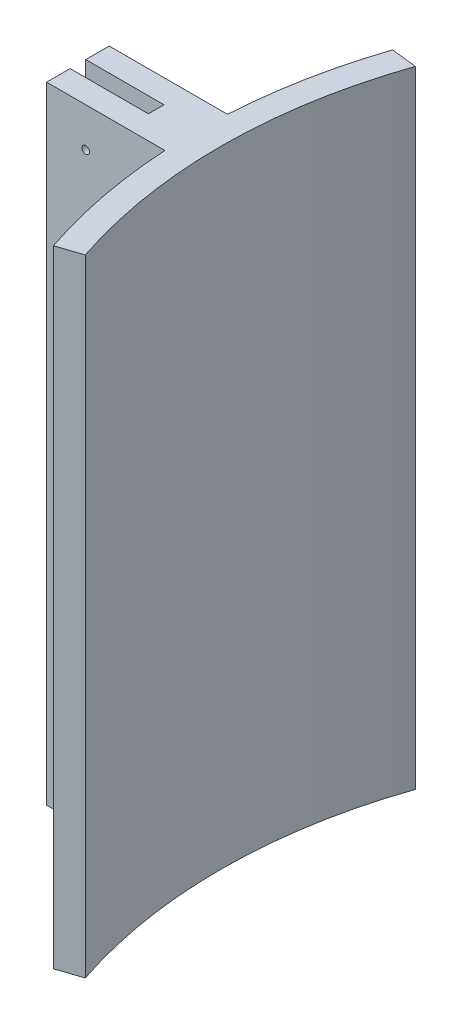
ISO-10303-21;
HEADER;
FILE_DESCRIPTION(('STEP AP214'),'2;1');
FILE_NAME('part.step','',(''),(''),'','','');
FILE_SCHEMA(('AUTOMOTIVE_DESIGN { 1 0 10303 214 1 1 1 1 }'));
ENDSEC;
DATA;
#1=APPLICATION_CONTEXT('core data for automotive mechanical design processes');
#2=APPLICATION_PROTOCOL_DEFINITION('international standard','automotive_design',2000,#1);
#3=PRODUCT_CONTEXT('',#1,'mechanical');
#4=PRODUCT('Part','Part','',(#3));
#5=PRODUCT_RELATED_PRODUCT_CATEGORY('part','',(#4));
#6=PRODUCT_DEFINITION_FORMATION('','',#4);
#7=PRODUCT_DEFINITION_CONTEXT('part definition',#1,'design');
#8=PRODUCT_DEFINITION('design','',#6,#7);
#9=PRODUCT_DEFINITION_SHAPE('','',#8);
#10=(LENGTH_UNIT() NAMED_UNIT(*) SI_UNIT(.MILLI.,.METRE.));
#11=(NAMED_UNIT(*) PLANE_ANGLE_UNIT() SI_UNIT($,.RADIAN.));
#12=(NAMED_UNIT(*) SI_UNIT($,.STERADIAN.) SOLID_ANGLE_UNIT());
#13=UNCERTAINTY_MEASURE_WITH_UNIT(LENGTH_MEASURE(1.E-05),#10,'distance_accuracy_value','');
#14=(GEOMETRIC_REPRESENTATION_CONTEXT(3) GLOBAL_UNCERTAINTY_ASSIGNED_CONTEXT((#13)) GLOBAL_UNIT_ASSIGNED_CONTEXT((#10,
#11,#12)) REPRESENTATION_CONTEXT('',''));
#15=CARTESIAN_POINT('',(0.,0.,0.));
#16=DIRECTION('',(0.,0.,1.));
#17=DIRECTION('',(1.,0.,0.));
#18=AXIS2_PLACEMENT_3D('',#15,#16,#17);
#19=CARTESIAN_POINT('',(0.,80.,0.));
#20=DIRECTION('',(0.,-1.,0.));
#21=DIRECTION('',(0.,0.,-1.));
#22=AXIS2_PLACEMENT_3D('',#19,#20,#21);
#23=CYLINDRICAL_SURFACE('',#22,65.);
#24=CARTESIAN_POINT('',(0.,0.,0.));
#25=DIRECTION('',(0.,-1.,0.));
#26=DIRECTION('',(0.,0.,-1.));
#27=AXIS2_PLACEMENT_3D('',#24,#25,#26);
#28=CIRCLE('',#27,65.);
#29=CARTESIAN_POINT('',(-61.6336537190224,0.,20.6468576118411));
#30=VERTEX_POINT('',#29);
#31=CARTESIAN_POINT('',(-61.4088709399135,0.,-21.3061157859675));
#32=VERTEX_POINT('',#31);
#33=EDGE_CURVE('E161',#30,#32,#28,.T.);
#34=ORIENTED_EDGE('',*,*,#33,.T.);
#35=DIRECTION('',(0.,-1.,0.));
#36=VECTOR('',#35,1.);
#37=CARTESIAN_POINT('',(-61.4088709399135,80.,-21.3061157859675));
#38=LINE('',#37,#36);
#39=CARTESIAN_POINT('',(-61.4088709399135,80.,-21.3061157859675));
#40=VERTEX_POINT('',#39);
#41=EDGE_CURVE('E11',#40,#32,#38,.T.);
#42=ORIENTED_EDGE('',*,*,#41,.F.);
#43=CARTESIAN_POINT('',(0.,80.,0.));
#44=DIRECTION('',(0.,-1.,0.));
#45=DIRECTION('',(0.,0.,-1.));
#46=AXIS2_PLACEMENT_3D('',#43,#44,#45);
#47=CIRCLE('',#46,65.);
#48=CARTESIAN_POINT('',(-61.6336537190224,80.,20.6468576118411));
#49=VERTEX_POINT('',#48);
#50=EDGE_CURVE('E186',#49,#40,#47,.T.);
#51=ORIENTED_EDGE('',*,*,#50,.F.);
#52=DIRECTION('',(0.,-1.,0.));
#53=VECTOR('',#52,1.);
#54=CARTESIAN_POINT('',(-61.6336537190224,80.,20.6468576118411));
#55=LINE('',#54,#53);
#56=EDGE_CURVE('E157',#49,#30,#55,.T.);
#57=ORIENTED_EDGE('',*,*,#56,.T.);
#58=EDGE_LOOP('',(#34,#42,#51,#57));
#59=FACE_BOUND('',#58,.T.);
#60=ADVANCED_FACE('F41',(#59),#23,.F.);
#61=CARTESIAN_POINT('',(-61.4088709399135,80.,-21.3061157859675));
#62=DIRECTION('',(-0.110407498959406,0.,0.9938864040591));
#63=DIRECTION('',(0.9938864040591,0.,0.110407498959406));
#64=AXIS2_PLACEMENT_3D('',#61,#62,#63);
#65=PLANE('',#64);
#66=DIRECTION('',(-0.9938864040591,0.,-0.110407498959406));
#67=VECTOR('',#66,1.);
#68=CARTESIAN_POINT('',(-61.4088709399135,0.,-21.3061157859675));
#69=LINE('',#68,#67);
#70=CARTESIAN_POINT('',(-64.6895195024809,0.,-21.6705520045117));
#71=VERTEX_POINT('',#70);
#72=EDGE_CURVE('E164',#32,#71,#69,.T.);
#73=ORIENTED_EDGE('',*,*,#72,.T.);
#74=DIRECTION('',(0.,-1.,0.));
#75=VECTOR('',#74,1.);
#76=CARTESIAN_POINT('',(-64.6895195024809,80.,-21.6705520045117));
#77=LINE('',#76,#75);
#78=CARTESIAN_POINT('',(-64.6895195024809,80.,-21.6705520045117));
#79=VERTEX_POINT('',#78);
#80=EDGE_CURVE('E50',#79,#71,#77,.T.);
#81=ORIENTED_EDGE('',*,*,#80,.F.);
#82=DIRECTION('',(-0.9938864040591,0.,-0.110407498959406));
#83=VECTOR('',#82,1.);
#84=CARTESIAN_POINT('',(-61.4088709399135,80.,-21.3061157859675));
#85=LINE('',#84,#83);
#86=EDGE_CURVE('E113',#40,#79,#85,.T.);
#87=ORIENTED_EDGE('',*,*,#86,.F.);
#88=ORIENTED_EDGE('',*,*,#41,.T.);
#89=EDGE_LOOP('',(#73,#81,#87,#88));
#90=FACE_BOUND('',#89,.T.);
#91=ADVANCED_FACE('F265',(#90),#65,.F.);
#92=CARTESIAN_POINT('',(0.,80.,0.));
#93=DIRECTION('',(0.,-1.,0.));
#94=DIRECTION('',(0.,0.,-1.));
#95=AXIS2_PLACEMENT_3D('',#92,#93,#94);
#96=CYLINDRICAL_SURFACE('',#95,68.2227730134308);
#97=CARTESIAN_POINT('',(0.,0.,0.));
#98=DIRECTION('',(0.,1.,0.));
#99=DIRECTION('',(0.,0.,-1.));
#100=AXIS2_PLACEMENT_3D('',#97,#98,#99);
#101=CIRCLE('',#100,68.2227730134308);
#102=CARTESIAN_POINT('',(-68.1054091658079,0.,-3.99999999999999));
#103=VERTEX_POINT('',#102);
#104=EDGE_CURVE('E167',#71,#103,#101,.T.);
#105=ORIENTED_EDGE('',*,*,#104,.T.);
#106=DIRECTION('',(0.,-1.,0.));
#107=VECTOR('',#106,1.);
#108=CARTESIAN_POINT('',(-68.1054091658079,80.,-3.99999999999999));
#109=LINE('',#108,#107);
#110=CARTESIAN_POINT('',(-68.1054091658079,80.,-3.99999999999999));
#111=VERTEX_POINT('',#110);
#112=EDGE_CURVE('E205',#111,#103,#109,.T.);
#113=ORIENTED_EDGE('',*,*,#112,.F.);
#114=CARTESIAN_POINT('',(0.,80.,0.));
#115=DIRECTION('',(0.,1.,0.));
#116=DIRECTION('',(0.,0.,-1.));
#117=AXIS2_PLACEMENT_3D('',#114,#115,#116);
#118=CIRCLE('',#117,68.2227730134308);
#119=EDGE_CURVE('E214',#79,#111,#118,.T.);
#120=ORIENTED_EDGE('',*,*,#119,.F.);
#121=ORIENTED_EDGE('',*,*,#80,.T.);
#122=EDGE_LOOP('',(#105,#113,#120,#121));
#123=FACE_BOUND('',#122,.T.);
#124=ADVANCED_FACE('F212',(#123),#96,.T.);
#125=CARTESIAN_POINT('',(-68.2227730134308,80.,-3.99999999999999));
#126=DIRECTION('',(0.,0.,1.));
#127=DIRECTION('',(1.,0.,0.));
#128=AXIS2_PLACEMENT_3D('',#125,#126,#127);
#129=PLANE('',#128);
#130=CARTESIAN_POINT('',(-78.2227730134308,75.,-3.99999999999999));
#131=DIRECTION('',(0.,0.,1.));
#132=DIRECTION('',(1.,0.,0.));
#133=AXIS2_PLACEMENT_3D('',#130,#131,#132);
#134=CIRCLE('',#133,0.474999999999989);
#135=CARTESIAN_POINT('',(-77.7477730134308,75.,-3.99999999999999));
#136=VERTEX_POINT('',#135);
#137=EDGE_CURVE('E498',#136,#136,#134,.T.);
#138=ORIENTED_EDGE('',*,*,#137,.T.);
#139=EDGE_LOOP('',(#138));
#140=FACE_BOUND('',#139,.T.);
#141=CARTESIAN_POINT('',(-78.2227730134308,40.,-3.99999999999999));
#142=DIRECTION('',(0.,0.,1.));
#143=DIRECTION('',(1.,0.,0.));
#144=AXIS2_PLACEMENT_3D('',#141,#142,#143);
#145=CIRCLE('',#144,0.474999999999989);
#146=CARTESIAN_POINT('',(-77.7477730134308,40.,-3.99999999999999));
#147=VERTEX_POINT('',#146);
#148=EDGE_CURVE('E309',#147,#147,#145,.T.);
#149=ORIENTED_EDGE('',*,*,#148,.T.);
#150=EDGE_LOOP('',(#149));
#151=FACE_BOUND('',#150,.T.);
#152=CARTESIAN_POINT('',(-78.2227730134308,5.,-3.99999999999999));
#153=DIRECTION('',(0.,0.,1.));
#154=DIRECTION('',(1.,0.,0.));
#155=AXIS2_PLACEMENT_3D('',#152,#153,#154);
#156=CIRCLE('',#155,0.474999999999989);
#157=CARTESIAN_POINT('',(-77.7477730134308,5.,-3.99999999999999));
#158=VERTEX_POINT('',#157);
#159=EDGE_CURVE('E165',#158,#158,#156,.T.);
#160=ORIENTED_EDGE('',*,*,#159,.T.);
#161=EDGE_LOOP('',(#160));
#162=FACE_BOUND('',#161,.T.);
#163=DIRECTION('',(-1.,0.,0.));
#164=VECTOR('',#163,1.);
#165=CARTESIAN_POINT('',(-68.2227730134308,0.,-3.99999999999999));
#166=LINE('',#165,#164);
#167=CARTESIAN_POINT('',(-83.2227730134308,0.,-3.99999999999999));
#168=VERTEX_POINT('',#167);
#169=EDGE_CURVE('E170',#103,#168,#166,.T.);
#170=ORIENTED_EDGE('',*,*,#169,.T.);
#171=DIRECTION('',(0.,-1.,0.));
#172=VECTOR('',#171,1.);
#173=CARTESIAN_POINT('',(-83.2227730134308,80.,-3.99999999999999));
#174=LINE('',#173,#172);
#175=CARTESIAN_POINT('',(-83.2227730134308,80.,-3.99999999999999));
#176=VERTEX_POINT('',#175);
#177=EDGE_CURVE('E202',#176,#168,#174,.T.);
#178=ORIENTED_EDGE('',*,*,#177,.F.);
#179=DIRECTION('',(-1.,0.,0.));
#180=VECTOR('',#179,1.);
#181=CARTESIAN_POINT('',(-68.2227730134308,80.,-3.99999999999999));
#182=LINE('',#181,#180);
#183=EDGE_CURVE('E231',#111,#176,#182,.T.);
#184=ORIENTED_EDGE('',*,*,#183,.F.);
#185=ORIENTED_EDGE('',*,*,#112,.T.);
#186=EDGE_LOOP('',(#170,#178,#184,#185));
#187=FACE_BOUND('',#186,.T.);
#188=ADVANCED_FACE('F222',(#140,#151,#162,#187),#129,.F.);
#189=CARTESIAN_POINT('',(-83.2227730134308,80.,-3.99999999999999));
#190=DIRECTION('',(1.,0.,0.));
#191=DIRECTION('',(0.,0.,-1.));
#192=AXIS2_PLACEMENT_3D('',#189,#190,#191);
#193=PLANE('',#192);
#194=DIRECTION('',(0.,0.,1.));
#195=VECTOR('',#194,1.);
#196=CARTESIAN_POINT('',(-83.2227730134308,0.,-3.99999999999999));
#197=LINE('',#196,#195);
#198=CARTESIAN_POINT('',(-83.2227730134308,0.,-1.00000000000002));
#199=VERTEX_POINT('',#198);
#200=EDGE_CURVE('E172',#168,#199,#197,.T.);
#201=ORIENTED_EDGE('',*,*,#200,.T.);
#202=DIRECTION('',(0.,-1.,0.));
#203=VECTOR('',#202,1.);
#204=CARTESIAN_POINT('',(-83.2227730134308,80.,-1.00000000000002));
#205=LINE('',#204,#203);
#206=CARTESIAN_POINT('',(-83.2227730134308,80.,-1.00000000000002));
#207=VERTEX_POINT('',#206);
#208=EDGE_CURVE('E199',#207,#199,#205,.T.);
#209=ORIENTED_EDGE('',*,*,#208,.F.);
#210=DIRECTION('',(0.,0.,1.));
#211=VECTOR('',#210,1.);
#212=CARTESIAN_POINT('',(-83.2227730134308,80.,-3.99999999999999));
#213=LINE('',#212,#211);
#214=EDGE_CURVE('E228',#176,#207,#213,.T.);
#215=ORIENTED_EDGE('',*,*,#214,.F.);
#216=ORIENTED_EDGE('',*,*,#177,.T.);
#217=EDGE_LOOP('',(#201,#209,#215,#216));
#218=FACE_BOUND('',#217,.T.);
#219=ADVANCED_FACE('F226',(#218),#193,.F.);
#220=CARTESIAN_POINT('',(-83.2227730134308,80.,-1.00000000000002));
#221=DIRECTION('',(0.,0.,-1.));
#222=DIRECTION('',(-1.,0.,0.));
#223=AXIS2_PLACEMENT_3D('',#220,#221,#222);
#224=PLANE('',#223);
#225=CARTESIAN_POINT('',(-78.2227730134308,75.,-1.00000000000002));
#226=DIRECTION('',(0.,0.,-1.));
#227=DIRECTION('',(-1.,0.,0.));
#228=AXIS2_PLACEMENT_3D('',#225,#226,#227);
#229=CIRCLE('',#228,0.474999999999989);
#230=CARTESIAN_POINT('',(-78.6977730134308,75.,-1.00000000000002));
#231=VERTEX_POINT('',#230);
#232=EDGE_CURVE('E504',#231,#231,#229,.T.);
#233=ORIENTED_EDGE('',*,*,#232,.T.);
#234=EDGE_LOOP('',(#233));
#235=FACE_BOUND('',#234,.T.);
#236=CARTESIAN_POINT('',(-78.2227730134308,40.,-1.00000000000002));
#237=DIRECTION('',(0.,0.,-1.));
#238=DIRECTION('',(-1.,0.,0.));
#239=AXIS2_PLACEMENT_3D('',#236,#237,#238);
#240=CIRCLE('',#239,0.474999999999989);
#241=CARTESIAN_POINT('',(-78.6977730134308,40.,-1.00000000000002));
#242=VERTEX_POINT('',#241);
#243=EDGE_CURVE('E44',#242,#242,#240,.T.);
#244=ORIENTED_EDGE('',*,*,#243,.T.);
#245=EDGE_LOOP('',(#244));
#246=FACE_BOUND('',#245,.T.);
#247=CARTESIAN_POINT('',(-78.2227730134308,5.,-1.00000000000002));
#248=DIRECTION('',(0.,0.,-1.));
#249=DIRECTION('',(-1.,0.,0.));
#250=AXIS2_PLACEMENT_3D('',#247,#248,#249);
#251=CIRCLE('',#250,0.474999999999989);
#252=CARTESIAN_POINT('',(-78.6977730134308,5.,-1.00000000000002));
#253=VERTEX_POINT('',#252);
#254=EDGE_CURVE('E312',#253,#253,#251,.T.);
#255=ORIENTED_EDGE('',*,*,#254,.T.);
#256=EDGE_LOOP('',(#255));
#257=FACE_BOUND('',#256,.T.);
#258=DIRECTION('',(1.,0.,0.));
#259=VECTOR('',#258,1.);
#260=CARTESIAN_POINT('',(-83.2227730134308,0.,-1.00000000000002));
#261=LINE('',#260,#259);
#262=CARTESIAN_POINT('',(-73.2227730134308,0.,-1.00000000000002));
#263=VERTEX_POINT('',#262);
#264=EDGE_CURVE('E174',#199,#263,#261,.T.);
#265=ORIENTED_EDGE('',*,*,#264,.T.);
#266=DIRECTION('',(0.,-1.,0.));
#267=VECTOR('',#266,1.);
#268=CARTESIAN_POINT('',(-73.2227730134308,80.,-1.00000000000002));
#269=LINE('',#268,#267);
#270=CARTESIAN_POINT('',(-73.2227730134308,80.,-1.00000000000002));
#271=VERTEX_POINT('',#270);
#272=EDGE_CURVE('E196',#271,#263,#269,.T.);
#273=ORIENTED_EDGE('',*,*,#272,.F.);
#274=DIRECTION('',(1.,0.,0.));
#275=VECTOR('',#274,1.);
#276=CARTESIAN_POINT('',(-83.2227730134308,80.,-1.00000000000002));
#277=LINE('',#276,#275);
#278=EDGE_CURVE('E230',#207,#271,#277,.T.);
#279=ORIENTED_EDGE('',*,*,#278,.F.);
#280=ORIENTED_EDGE('',*,*,#208,.T.);
#281=EDGE_LOOP('',(#265,#273,#279,#280));
#282=FACE_BOUND('',#281,.T.);
#283=ADVANCED_FACE('F279',(#235,#246,#257,#282),#224,.F.);
#284=CARTESIAN_POINT('',(-73.2227730134308,80.,1.00000000000001));
#285=DIRECTION('',(1.,0.,0.));
#286=DIRECTION('',(0.,0.,-1.));
#287=AXIS2_PLACEMENT_3D('',#284,#285,#286);
#288=PLANE('',#287);
#289=DIRECTION('',(0.,0.,1.));
#290=VECTOR('',#289,1.);
#291=CARTESIAN_POINT('',(-73.2227730134308,0.,1.00000000000001));
#292=LINE('',#291,#290);
#293=CARTESIAN_POINT('',(-73.2227730134308,0.,1.00000000000001));
#294=VERTEX_POINT('',#293);
#295=EDGE_CURVE('E176',#263,#294,#292,.T.);
#296=ORIENTED_EDGE('',*,*,#295,.T.);
#297=DIRECTION('',(0.,-1.,0.));
#298=VECTOR('',#297,1.);
#299=CARTESIAN_POINT('',(-73.2227730134308,80.,1.00000000000001));
#300=LINE('',#299,#298);
#301=CARTESIAN_POINT('',(-73.2227730134308,80.,1.00000000000001));
#302=VERTEX_POINT('',#301);
#303=EDGE_CURVE('E193',#302,#294,#300,.T.);
#304=ORIENTED_EDGE('',*,*,#303,.F.);
#305=DIRECTION('',(0.,0.,1.));
#306=VECTOR('',#305,1.);
#307=CARTESIAN_POINT('',(-73.2227730134308,80.,1.00000000000001));
#308=LINE('',#307,#306);
#309=EDGE_CURVE('E233',#271,#302,#308,.T.);
#310=ORIENTED_EDGE('',*,*,#309,.F.);
#311=ORIENTED_EDGE('',*,*,#272,.T.);
#312=EDGE_LOOP('',(#296,#304,#310,#311));
#313=FACE_BOUND('',#312,.T.);
#314=ADVANCED_FACE('F282',(#313),#288,.F.);
#315=CARTESIAN_POINT('',(-83.2227730134308,80.,1.00000000000001));
#316=DIRECTION('',(0.,0.,1.));
#317=DIRECTION('',(1.,0.,0.));
#318=AXIS2_PLACEMENT_3D('',#315,#316,#317);
#319=PLANE('',#318);
#320=CARTESIAN_POINT('',(-78.2227730134308,75.,1.00000000000001));
#321=DIRECTION('',(0.,0.,1.));
#322=DIRECTION('',(1.,0.,0.));
#323=AXIS2_PLACEMENT_3D('',#320,#321,#322);
#324=CIRCLE('',#323,0.474999999999989);
#325=CARTESIAN_POINT('',(-77.7477730134308,75.,1.00000000000001));
#326=VERTEX_POINT('',#325);
#327=EDGE_CURVE('E501',#326,#326,#324,.T.);
#328=ORIENTED_EDGE('',*,*,#327,.T.);
#329=EDGE_LOOP('',(#328));
#330=FACE_BOUND('',#329,.T.);
#331=CARTESIAN_POINT('',(-78.2227730134308,40.,1.00000000000001));
#332=DIRECTION('',(0.,0.,1.));
#333=DIRECTION('',(1.,0.,0.));
#334=AXIS2_PLACEMENT_3D('',#331,#332,#333);
#335=CIRCLE('',#334,0.474999999999989);
#336=CARTESIAN_POINT('',(-77.7477730134308,40.,1.00000000000001));
#337=VERTEX_POINT('',#336);
#338=EDGE_CURVE('E315',#337,#337,#335,.T.);
#339=ORIENTED_EDGE('',*,*,#338,.T.);
#340=EDGE_LOOP('',(#339));
#341=FACE_BOUND('',#340,.T.);
#342=CARTESIAN_POINT('',(-78.2227730134308,5.,1.00000000000001));
#343=DIRECTION('',(0.,0.,1.));
#344=DIRECTION('',(1.,0.,0.));
#345=AXIS2_PLACEMENT_3D('',#342,#343,#344);
#346=CIRCLE('',#345,0.474999999999989);
#347=CARTESIAN_POINT('',(-77.7477730134308,5.,1.00000000000001));
#348=VERTEX_POINT('',#347);
#349=EDGE_CURVE('E308',#348,#348,#346,.T.);
#350=ORIENTED_EDGE('',*,*,#349,.T.);
#351=EDGE_LOOP('',(#350));
#352=FACE_BOUND('',#351,.T.);
#353=DIRECTION('',(-1.,0.,0.));
#354=VECTOR('',#353,1.);
#355=CARTESIAN_POINT('',(-83.2227730134308,0.,1.00000000000001));
#356=LINE('',#355,#354);
#357=CARTESIAN_POINT('',(-83.2227730134308,0.,1.00000000000001));
#358=VERTEX_POINT('',#357);
#359=EDGE_CURVE('E178',#294,#358,#356,.T.);
#360=ORIENTED_EDGE('',*,*,#359,.T.);
#361=DIRECTION('',(0.,-1.,0.));
#362=VECTOR('',#361,1.);
#363=CARTESIAN_POINT('',(-83.2227730134308,80.,1.00000000000001));
#364=LINE('',#363,#362);
#365=CARTESIAN_POINT('',(-83.2227730134308,80.,1.00000000000001));
#366=VERTEX_POINT('',#365);
#367=EDGE_CURVE('E190',#366,#358,#364,.T.);
#368=ORIENTED_EDGE('',*,*,#367,.F.);
#369=DIRECTION('',(-1.,0.,0.));
#370=VECTOR('',#369,1.);
#371=CARTESIAN_POINT('',(-83.2227730134308,80.,1.00000000000001));
#372=LINE('',#371,#370);
#373=EDGE_CURVE('E239',#302,#366,#372,.T.);
#374=ORIENTED_EDGE('',*,*,#373,.F.);
#375=ORIENTED_EDGE('',*,*,#303,.T.);
#376=EDGE_LOOP('',(#360,#368,#374,#375));
#377=FACE_BOUND('',#376,.T.);
#378=ADVANCED_FACE('F245',(#330,#341,#352,#377),#319,.F.);
#379=CARTESIAN_POINT('',(-83.2227730134308,80.,1.00000000000001));
#380=DIRECTION('',(1.,0.,0.));
#381=DIRECTION('',(0.,0.,-1.));
#382=AXIS2_PLACEMENT_3D('',#379,#380,#381);
#383=PLANE('',#382);
#384=DIRECTION('',(0.,0.,1.));
#385=VECTOR('',#384,1.);
#386=CARTESIAN_POINT('',(-83.2227730134308,0.,1.00000000000001));
#387=LINE('',#386,#385);
#388=CARTESIAN_POINT('',(-83.2227730134308,0.,4.00000000000001));
#389=VERTEX_POINT('',#388);
#390=EDGE_CURVE('E180',#358,#389,#387,.T.);
#391=ORIENTED_EDGE('',*,*,#390,.T.);
#392=DIRECTION('',(0.,-1.,0.));
#393=VECTOR('',#392,1.);
#394=CARTESIAN_POINT('',(-83.2227730134308,80.,4.00000000000001));
#395=LINE('',#394,#393);
#396=CARTESIAN_POINT('',(-83.2227730134308,80.,4.00000000000001));
#397=VERTEX_POINT('',#396);
#398=EDGE_CURVE('E152',#397,#389,#395,.T.);
#399=ORIENTED_EDGE('',*,*,#398,.F.);
#400=DIRECTION('',(0.,0.,1.));
#401=VECTOR('',#400,1.);
#402=CARTESIAN_POINT('',(-83.2227730134308,80.,1.00000000000001));
#403=LINE('',#402,#401);
#404=EDGE_CURVE('E144',#366,#397,#403,.T.);
#405=ORIENTED_EDGE('',*,*,#404,.F.);
#406=ORIENTED_EDGE('',*,*,#367,.T.);
#407=EDGE_LOOP('',(#391,#399,#405,#406));
#408=FACE_BOUND('',#407,.T.);
#409=ADVANCED_FACE('F249',(#408),#383,.F.);
#410=CARTESIAN_POINT('',(-68.2227730134308,80.,4.00000000000001));
#411=DIRECTION('',(0.,0.,-1.));
#412=DIRECTION('',(-1.,0.,0.));
#413=AXIS2_PLACEMENT_3D('',#410,#411,#412);
#414=PLANE('',#413);
#415=CARTESIAN_POINT('',(-78.2227730134308,75.,4.00000000000001));
#416=DIRECTION('',(0.,0.,1.));
#417=DIRECTION('',(1.,0.,0.));
#418=AXIS2_PLACEMENT_3D('',#415,#416,#417);
#419=CIRCLE('',#418,0.474999999999989);
#420=CARTESIAN_POINT('',(-77.7477730134308,75.,4.00000000000001));
#421=VERTEX_POINT('',#420);
#422=EDGE_CURVE('E299',#421,#421,#419,.T.);
#423=ORIENTED_EDGE('',*,*,#422,.F.);
#424=EDGE_LOOP('',(#423));
#425=FACE_BOUND('',#424,.T.);
#426=CARTESIAN_POINT('',(-78.2227730134308,40.,4.00000000000001));
#427=DIRECTION('',(0.,0.,1.));
#428=DIRECTION('',(1.,0.,0.));
#429=AXIS2_PLACEMENT_3D('',#426,#427,#428);
#430=CIRCLE('',#429,0.474999999999989);
#431=CARTESIAN_POINT('',(-77.7477730134308,40.,4.00000000000001));
#432=VERTEX_POINT('',#431);
#433=EDGE_CURVE('E303',#432,#432,#430,.T.);
#434=ORIENTED_EDGE('',*,*,#433,.F.);
#435=EDGE_LOOP('',(#434));
#436=FACE_BOUND('',#435,.T.);
#437=CARTESIAN_POINT('',(-78.2227730134308,5.,4.00000000000001));
#438=DIRECTION('',(0.,0.,1.));
#439=DIRECTION('',(1.,0.,0.));
#440=AXIS2_PLACEMENT_3D('',#437,#438,#439);
#441=CIRCLE('',#440,0.474999999999989);
#442=CARTESIAN_POINT('',(-77.7477730134308,5.,4.00000000000001));
#443=VERTEX_POINT('',#442);
#444=EDGE_CURVE('E306',#443,#443,#441,.T.);
#445=ORIENTED_EDGE('',*,*,#444,.F.);
#446=EDGE_LOOP('',(#445));
#447=FACE_BOUND('',#446,.T.);
#448=DIRECTION('',(1.,0.,0.));
#449=VECTOR('',#448,1.);
#450=CARTESIAN_POINT('',(-68.2227730134308,0.,4.00000000000001));
#451=LINE('',#450,#449);
#452=CARTESIAN_POINT('',(-68.1054091658079,0.,4.00000000000004));
#453=VERTEX_POINT('',#452);
#454=EDGE_CURVE('E151',#389,#453,#451,.T.);
#455=ORIENTED_EDGE('',*,*,#454,.T.);
#456=DIRECTION('',(0.,-1.,0.));
#457=VECTOR('',#456,1.);
#458=CARTESIAN_POINT('',(-68.1054091658079,80.,4.00000000000004));
#459=LINE('',#458,#457);
#460=CARTESIAN_POINT('',(-68.1054091658079,80.,4.00000000000004));
#461=VERTEX_POINT('',#460);
#462=EDGE_CURVE('E149',#461,#453,#459,.T.);
#463=ORIENTED_EDGE('',*,*,#462,.F.);
#464=DIRECTION('',(1.,0.,0.));
#465=VECTOR('',#464,1.);
#466=CARTESIAN_POINT('',(-68.2227730134308,80.,4.00000000000001));
#467=LINE('',#466,#465);
#468=EDGE_CURVE('E138',#397,#461,#467,.T.);
#469=ORIENTED_EDGE('',*,*,#468,.F.);
#470=ORIENTED_EDGE('',*,*,#398,.T.);
#471=EDGE_LOOP('',(#455,#463,#469,#470));
#472=FACE_BOUND('',#471,.T.);
#473=ADVANCED_FACE('F150',(#425,#436,#447,#472),#414,.F.);
#474=CARTESIAN_POINT('',(0.,80.,0.));
#475=DIRECTION('',(0.,-1.,0.));
#476=DIRECTION('',(0.,0.,-1.));
#477=AXIS2_PLACEMENT_3D('',#474,#475,#476);
#478=CYLINDRICAL_SURFACE('',#477,68.2227730134308);
#479=CARTESIAN_POINT('',(0.,0.,0.));
#480=DIRECTION('',(0.,1.,0.));
#481=DIRECTION('',(0.,0.,-1.));
#482=AXIS2_PLACEMENT_3D('',#479,#480,#481);
#483=CIRCLE('',#482,68.2227730134308);
#484=CARTESIAN_POINT('',(-64.6895195024809,0.,21.6705520045118));
#485=VERTEX_POINT('',#484);
#486=EDGE_CURVE('E99',#453,#485,#483,.T.);
#487=ORIENTED_EDGE('',*,*,#486,.T.);
#488=DIRECTION('',(0.,-1.,0.));
#489=VECTOR('',#488,1.);
#490=CARTESIAN_POINT('',(-64.6895195024809,80.,21.6705520045118));
#491=LINE('',#490,#489);
#492=CARTESIAN_POINT('',(-64.6895195024809,80.,21.6705520045118));
#493=VERTEX_POINT('',#492);
#494=EDGE_CURVE('E153',#493,#485,#491,.T.);
#495=ORIENTED_EDGE('',*,*,#494,.F.);
#496=CARTESIAN_POINT('',(0.,80.,0.));
#497=DIRECTION('',(0.,1.,0.));
#498=DIRECTION('',(0.,0.,-1.));
#499=AXIS2_PLACEMENT_3D('',#496,#497,#498);
#500=CIRCLE('',#499,68.2227730134308);
#501=EDGE_CURVE('E142',#461,#493,#500,.T.);
#502=ORIENTED_EDGE('',*,*,#501,.F.);
#503=ORIENTED_EDGE('',*,*,#462,.T.);
#504=EDGE_LOOP('',(#487,#495,#502,#503));
#505=FACE_BOUND('',#504,.T.);
#506=ADVANCED_FACE('F155',(#505),#478,.T.);
#507=CARTESIAN_POINT('',(-61.6336537190224,80.,20.6468576118411));
#508=DIRECTION('',(-0.317643963259093,0.,-0.948210057215729));
#509=DIRECTION('',(-0.948210057215729,0.,0.317643963259093));
#510=AXIS2_PLACEMENT_3D('',#507,#508,#509);
#511=PLANE('',#510);
#512=DIRECTION('',(0.948210057215729,0.,-0.317643963259093));
#513=VECTOR('',#512,1.);
#514=CARTESIAN_POINT('',(-61.6336537190224,0.,20.6468576118411));
#515=LINE('',#514,#513);
#516=EDGE_CURVE('E105',#485,#30,#515,.T.);
#517=ORIENTED_EDGE('',*,*,#516,.T.);
#518=ORIENTED_EDGE('',*,*,#56,.F.);
#519=DIRECTION('',(0.948210057215729,0.,-0.317643963259093));
#520=VECTOR('',#519,1.);
#521=CARTESIAN_POINT('',(-61.6336537190224,80.,20.6468576118411));
#522=LINE('',#521,#520);
#523=EDGE_CURVE('E58',#493,#49,#522,.T.);
#524=ORIENTED_EDGE('',*,*,#523,.F.);
#525=ORIENTED_EDGE('',*,*,#494,.T.);
#526=EDGE_LOOP('',(#517,#518,#524,#525));
#527=FACE_BOUND('',#526,.T.);
#528=ADVANCED_FACE('F254',(#527),#511,.F.);
#529=CARTESIAN_POINT('',(0.,80.,0.));
#530=DIRECTION('',(0.,-1.,0.));
#531=DIRECTION('',(0.,0.,-1.));
#532=AXIS2_PLACEMENT_3D('',#529,#530,#531);
#533=PLANE('',#532);
#534=ORIENTED_EDGE('',*,*,#50,.T.);
#535=ORIENTED_EDGE('',*,*,#86,.T.);
#536=ORIENTED_EDGE('',*,*,#119,.T.);
#537=ORIENTED_EDGE('',*,*,#183,.T.);
#538=ORIENTED_EDGE('',*,*,#214,.T.);
#539=ORIENTED_EDGE('',*,*,#278,.T.);
#540=ORIENTED_EDGE('',*,*,#309,.T.);
#541=ORIENTED_EDGE('',*,*,#373,.T.);
#542=ORIENTED_EDGE('',*,*,#404,.T.);
#543=ORIENTED_EDGE('',*,*,#468,.T.);
#544=ORIENTED_EDGE('',*,*,#501,.T.);
#545=ORIENTED_EDGE('',*,*,#523,.T.);
#546=EDGE_LOOP('',(#534,#535,#536,#537,#538,#539,#540,#541,#542,#543,#544,#545));
#547=FACE_BOUND('',#546,.T.);
#548=ADVANCED_FACE('F140',(#547),#533,.F.);
#549=CARTESIAN_POINT('',(0.,0.,0.));
#550=DIRECTION('',(0.,-1.,0.));
#551=DIRECTION('',(0.,0.,-1.));
#552=AXIS2_PLACEMENT_3D('',#549,#550,#551);
#553=PLANE('',#552);
#554=ORIENTED_EDGE('',*,*,#33,.F.);
#555=ORIENTED_EDGE('',*,*,#516,.F.);
#556=ORIENTED_EDGE('',*,*,#486,.F.);
#557=ORIENTED_EDGE('',*,*,#454,.F.);
#558=ORIENTED_EDGE('',*,*,#390,.F.);
#559=ORIENTED_EDGE('',*,*,#359,.F.);
#560=ORIENTED_EDGE('',*,*,#295,.F.);
#561=ORIENTED_EDGE('',*,*,#264,.F.);
#562=ORIENTED_EDGE('',*,*,#200,.F.);
#563=ORIENTED_EDGE('',*,*,#169,.F.);
#564=ORIENTED_EDGE('',*,*,#104,.F.);
#565=ORIENTED_EDGE('',*,*,#72,.F.);
#566=EDGE_LOOP('',(#554,#555,#556,#557,#558,#559,#560,#561,#562,#563,#564,#565));
#567=FACE_BOUND('',#566,.T.);
#568=ADVANCED_FACE('F217',(#567),#553,.T.);
#569=CARTESIAN_POINT('',(-78.2227730134308,5.,4.00000000000001));
#570=DIRECTION('',(0.,0.,1.));
#571=DIRECTION('',(1.,0.,0.));
#572=AXIS2_PLACEMENT_3D('',#569,#570,#571);
#573=CYLINDRICAL_SURFACE('',#572,0.474999999999989);
#574=ORIENTED_EDGE('',*,*,#444,.T.);
#575=EDGE_LOOP('',(#574));
#576=FACE_BOUND('',#575,.T.);
#577=ORIENTED_EDGE('',*,*,#349,.F.);
#578=EDGE_LOOP('',(#577));
#579=FACE_BOUND('',#578,.T.);
#580=ADVANCED_FACE('F330',(#576,#579),#573,.F.);
#581=ORIENTED_EDGE('',*,*,#254,.F.);
#582=EDGE_LOOP('',(#581));
#583=FACE_BOUND('',#582,.T.);
#584=ORIENTED_EDGE('',*,*,#159,.F.);
#585=EDGE_LOOP('',(#584));
#586=FACE_BOUND('',#585,.T.);
#587=ADVANCED_FACE('F327',(#583,#586),#573,.F.);
#588=CARTESIAN_POINT('',(-78.2227730134308,40.,4.00000000000001));
#589=DIRECTION('',(0.,0.,1.));
#590=DIRECTION('',(1.,0.,0.));
#591=AXIS2_PLACEMENT_3D('',#588,#589,#590);
#592=CYLINDRICAL_SURFACE('',#591,0.474999999999989);
#593=ORIENTED_EDGE('',*,*,#243,.F.);
#594=EDGE_LOOP('',(#593));
#595=FACE_BOUND('',#594,.T.);
#596=ORIENTED_EDGE('',*,*,#148,.F.);
#597=EDGE_LOOP('',(#596));
#598=FACE_BOUND('',#597,.T.);
#599=ADVANCED_FACE('F329',(#595,#598),#592,.F.);
#600=ORIENTED_EDGE('',*,*,#433,.T.);
#601=EDGE_LOOP('',(#600));
#602=FACE_BOUND('',#601,.T.);
#603=ORIENTED_EDGE('',*,*,#338,.F.);
#604=EDGE_LOOP('',(#603));
#605=FACE_BOUND('',#604,.T.);
#606=ADVANCED_FACE('F337',(#602,#605),#592,.F.);
#607=CARTESIAN_POINT('',(-78.2227730134308,75.,4.00000000000001));
#608=DIRECTION('',(0.,0.,1.));
#609=DIRECTION('',(1.,0.,0.));
#610=AXIS2_PLACEMENT_3D('',#607,#608,#609);
#611=CYLINDRICAL_SURFACE('',#610,0.474999999999989);
#612=ORIENTED_EDGE('',*,*,#422,.T.);
#613=EDGE_LOOP('',(#612));
#614=FACE_BOUND('',#613,.T.);
#615=ORIENTED_EDGE('',*,*,#327,.F.);
#616=EDGE_LOOP('',(#615));
#617=FACE_BOUND('',#616,.T.);
#618=ADVANCED_FACE('F364',(#614,#617),#611,.F.);
#619=ORIENTED_EDGE('',*,*,#232,.F.);
#620=EDGE_LOOP('',(#619));
#621=FACE_BOUND('',#620,.T.);
#622=ORIENTED_EDGE('',*,*,#137,.F.);
#623=EDGE_LOOP('',(#622));
#624=FACE_BOUND('',#623,.T.);
#625=ADVANCED_FACE('F368',(#621,#624),#611,.F.);
#626=CLOSED_SHELL('',(#60,#91,#124,#188,#219,#283,#314,#378,#409,#473,#506,#528,#548,#568,#580,
#587,#599,#606,#618,#625));
#627=MANIFOLD_SOLID_BREP('B2',#626);
#628=ADVANCED_BREP_SHAPE_REPRESENTATION('',(#18,#627),#14);
#629=SHAPE_DEFINITION_REPRESENTATION(#9,#628);
ENDSEC;
END-ISO-10303-21;
